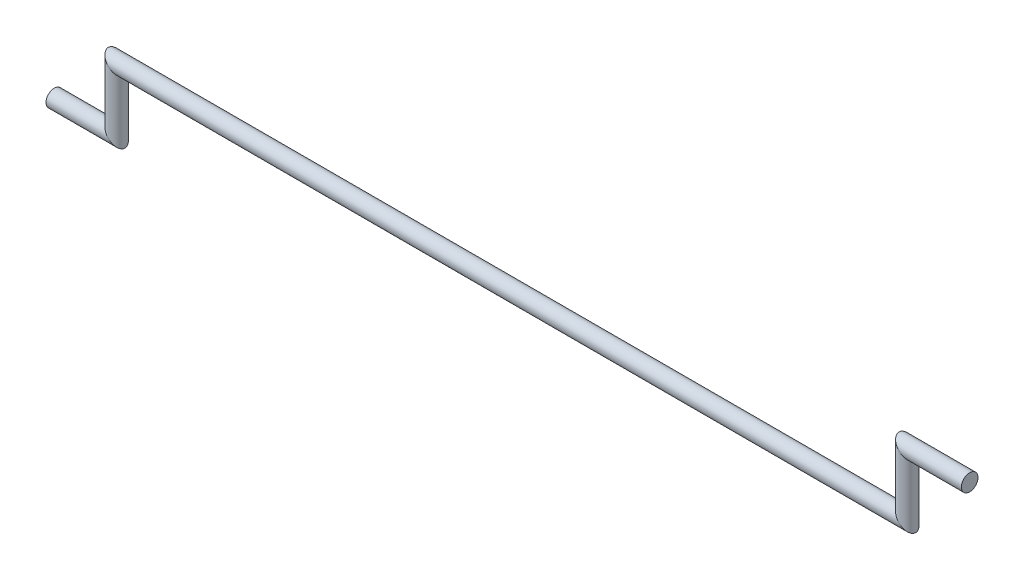
ISO-10303-21;
HEADER;
FILE_DESCRIPTION(('STEP AP214'),'2;1');
FILE_NAME('part.step','',(''),(''),'','','');
FILE_SCHEMA(('AUTOMOTIVE_DESIGN { 1 0 10303 214 1 1 1 1 }'));
ENDSEC;
DATA;
#1=APPLICATION_CONTEXT('core data for automotive mechanical design processes');
#2=APPLICATION_PROTOCOL_DEFINITION('international standard','automotive_design',2000,#1);
#3=PRODUCT_CONTEXT('',#1,'mechanical');
#4=PRODUCT('Part','Part','',(#3));
#5=PRODUCT_RELATED_PRODUCT_CATEGORY('part','',(#4));
#6=PRODUCT_DEFINITION_FORMATION('','',#4);
#7=PRODUCT_DEFINITION_CONTEXT('part definition',#1,'design');
#8=PRODUCT_DEFINITION('design','',#6,#7);
#9=PRODUCT_DEFINITION_SHAPE('','',#8);
#10=(LENGTH_UNIT() NAMED_UNIT(*) SI_UNIT(.MILLI.,.METRE.));
#11=(NAMED_UNIT(*) PLANE_ANGLE_UNIT() SI_UNIT($,.RADIAN.));
#12=(NAMED_UNIT(*) SI_UNIT($,.STERADIAN.) SOLID_ANGLE_UNIT());
#13=UNCERTAINTY_MEASURE_WITH_UNIT(LENGTH_MEASURE(1.E-05),#10,'distance_accuracy_value','');
#14=(GEOMETRIC_REPRESENTATION_CONTEXT(3) GLOBAL_UNCERTAINTY_ASSIGNED_CONTEXT((#13)) GLOBAL_UNIT_ASSIGNED_CONTEXT((#10,
#11,#12)) REPRESENTATION_CONTEXT('',''));
#15=CARTESIAN_POINT('',(0.,0.,0.));
#16=DIRECTION('',(0.,0.,1.));
#17=DIRECTION('',(1.,0.,0.));
#18=AXIS2_PLACEMENT_3D('',#15,#16,#17);
#19=CARTESIAN_POINT('',(44.05,6.,0.));
#20=DIRECTION('',(1.,0.,0.));
#21=DIRECTION('',(0.,0.,-1.));
#22=AXIS2_PLACEMENT_3D('',#19,#20,#21);
#23=PLANE('',#22);
#24=CARTESIAN_POINT('',(44.05,6.,0.));
#25=DIRECTION('',(1.,0.,0.));
#26=DIRECTION('',(0.,0.,-1.));
#27=AXIS2_PLACEMENT_3D('',#24,#25,#26);
#28=CIRCLE('',#27,0.4);
#29=CARTESIAN_POINT('',(44.05,6.,-0.4));
#30=VERTEX_POINT('',#29);
#31=EDGE_CURVE('E40',#30,#30,#28,.T.);
#32=ORIENTED_EDGE('',*,*,#31,.T.);
#33=EDGE_LOOP('',(#32));
#34=FACE_BOUND('',#33,.T.);
#35=ADVANCED_FACE('F37',(#34),#23,.T.);
#36=CARTESIAN_POINT('',(0.,0.,0.));
#37=DIRECTION('',(1.,0.,0.));
#38=DIRECTION('',(0.,0.,-1.));
#39=AXIS2_PLACEMENT_3D('',#36,#37,#38);
#40=PLANE('',#39);
#41=CARTESIAN_POINT('',(0.,0.,0.));
#42=DIRECTION('',(1.,0.,0.));
#43=DIRECTION('',(0.,0.,-1.));
#44=AXIS2_PLACEMENT_3D('',#41,#42,#43);
#45=CIRCLE('',#44,0.4);
#46=CARTESIAN_POINT('',(0.,0.,-0.4));
#47=VERTEX_POINT('',#46);
#48=EDGE_CURVE('E44',#47,#47,#45,.T.);
#49=ORIENTED_EDGE('',*,*,#48,.F.);
#50=EDGE_LOOP('',(#49));
#51=FACE_BOUND('',#50,.T.);
#52=ADVANCED_FACE('F67',(#51),#40,.F.);
#53=CARTESIAN_POINT('',(40.07,6.,0.));
#54=DIRECTION('',(1.,0.,0.));
#55=DIRECTION('',(0.,0.,-1.));
#56=AXIS2_PLACEMENT_3D('',#53,#54,#55);
#57=CYLINDRICAL_SURFACE('',#56,0.4);
#58=CARTESIAN_POINT('',(41.05,6.,0.));
#59=DIRECTION('',(0.707106781186548,0.707106781186548,0.));
#60=DIRECTION('',(-0.707106781186548,0.707106781186548,0.));
#61=AXIS2_PLACEMENT_3D('',#58,#59,#60);
#62=ELLIPSE('',#61,0.565685424949238,0.4);
#63=CARTESIAN_POINT('',(40.65,6.4,0.));
#64=VERTEX_POINT('',#63);
#65=EDGE_CURVE('E56',#64,#64,#62,.F.);
#66=ORIENTED_EDGE('',*,*,#65,.F.);
#67=EDGE_LOOP('',(#66));
#68=FACE_BOUND('',#67,.T.);
#69=ORIENTED_EDGE('',*,*,#31,.F.);
#70=EDGE_LOOP('',(#69));
#71=FACE_BOUND('',#70,.T.);
#72=ADVANCED_FACE('F64',(#68,#71),#57,.T.);
#73=CARTESIAN_POINT('',(41.05,2.02,0.));
#74=DIRECTION('',(0.,1.,0.));
#75=DIRECTION('',(0.,0.,1.));
#76=AXIS2_PLACEMENT_3D('',#73,#74,#75);
#77=CYLINDRICAL_SURFACE('',#76,0.4);
#78=CARTESIAN_POINT('',(41.05,3.,0.));
#79=DIRECTION('',(0.707106781186548,0.707106781186548,0.));
#80=DIRECTION('',(0.707106781186548,-0.707106781186548,0.));
#81=AXIS2_PLACEMENT_3D('',#78,#79,#80);
#82=ELLIPSE('',#81,0.565685424949238,0.4);
#83=CARTESIAN_POINT('',(41.45,2.6,0.));
#84=VERTEX_POINT('',#83);
#85=EDGE_CURVE('E54',#84,#84,#82,.F.);
#86=ORIENTED_EDGE('',*,*,#85,.F.);
#87=EDGE_LOOP('',(#86));
#88=FACE_BOUND('',#87,.T.);
#89=ORIENTED_EDGE('',*,*,#65,.T.);
#90=EDGE_LOOP('',(#89));
#91=FACE_BOUND('',#90,.T.);
#92=ADVANCED_FACE('F66',(#88,#91),#77,.T.);
#93=CARTESIAN_POINT('',(2.02,3.,0.));
#94=DIRECTION('',(1.,0.,0.));
#95=DIRECTION('',(0.,0.,-1.));
#96=AXIS2_PLACEMENT_3D('',#93,#94,#95);
#97=CYLINDRICAL_SURFACE('',#96,0.4);
#98=CARTESIAN_POINT('',(3.,3.,0.));
#99=DIRECTION('',(0.707106781186548,0.707106781186548,0.));
#100=DIRECTION('',(-0.707106781186548,0.707106781186548,0.));
#101=AXIS2_PLACEMENT_3D('',#98,#99,#100);
#102=ELLIPSE('',#101,0.565685424949238,0.4);
#103=CARTESIAN_POINT('',(2.6,3.4,0.));
#104=VERTEX_POINT('',#103);
#105=EDGE_CURVE('E49',#104,#104,#102,.F.);
#106=ORIENTED_EDGE('',*,*,#105,.F.);
#107=EDGE_LOOP('',(#106));
#108=FACE_BOUND('',#107,.T.);
#109=ORIENTED_EDGE('',*,*,#85,.T.);
#110=EDGE_LOOP('',(#109));
#111=FACE_BOUND('',#110,.T.);
#112=ADVANCED_FACE('F74',(#108,#111),#97,.T.);
#113=CARTESIAN_POINT('',(3.,-0.98,0.));
#114=DIRECTION('',(0.,1.,0.));
#115=DIRECTION('',(0.,0.,1.));
#116=AXIS2_PLACEMENT_3D('',#113,#114,#115);
#117=CYLINDRICAL_SURFACE('',#116,0.4);
#118=CARTESIAN_POINT('',(3.,0.,0.));
#119=DIRECTION('',(0.707106781186547,0.707106781186547,0.));
#120=DIRECTION('',(0.707106781186548,-0.707106781186548,0.));
#121=AXIS2_PLACEMENT_3D('',#118,#119,#120);
#122=ELLIPSE('',#121,0.565685424949238,0.4);
#123=CARTESIAN_POINT('',(3.4,-0.4,0.));
#124=VERTEX_POINT('',#123);
#125=EDGE_CURVE('E10',#124,#124,#122,.F.);
#126=ORIENTED_EDGE('',*,*,#125,.F.);
#127=EDGE_LOOP('',(#126));
#128=FACE_BOUND('',#127,.T.);
#129=ORIENTED_EDGE('',*,*,#105,.T.);
#130=EDGE_LOOP('',(#129));
#131=FACE_BOUND('',#130,.T.);
#132=ADVANCED_FACE('F80',(#128,#131),#117,.T.);
#133=CARTESIAN_POINT('',(0.,0.,0.));
#134=DIRECTION('',(1.,0.,0.));
#135=DIRECTION('',(0.,0.,-1.));
#136=AXIS2_PLACEMENT_3D('',#133,#134,#135);
#137=CYLINDRICAL_SURFACE('',#136,0.4);
#138=ORIENTED_EDGE('',*,*,#48,.T.);
#139=EDGE_LOOP('',(#138));
#140=FACE_BOUND('',#139,.T.);
#141=ORIENTED_EDGE('',*,*,#125,.T.);
#142=EDGE_LOOP('',(#141));
#143=FACE_BOUND('',#142,.T.);
#144=ADVANCED_FACE('F78',(#140,#143),#137,.T.);
#145=CLOSED_SHELL('',(#35,#52,#72,#92,#112,#132,#144));
#146=MANIFOLD_SOLID_BREP('B2',#145);
#147=ADVANCED_BREP_SHAPE_REPRESENTATION('',(#18,#146),#14);
#148=SHAPE_DEFINITION_REPRESENTATION(#9,#147);
ENDSEC;
END-ISO-10303-21;
